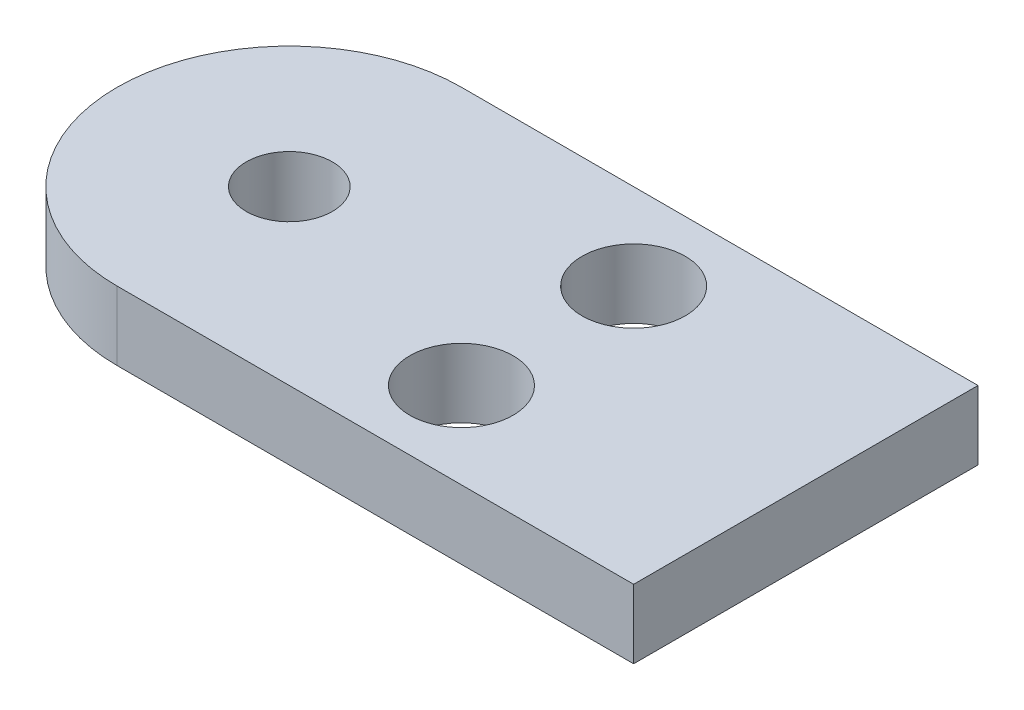
ISO-10303-21;
HEADER;
FILE_DESCRIPTION(('STEP AP214'),'2;1');
FILE_NAME('part.step','',(''),(''),'','','');
FILE_SCHEMA(('AUTOMOTIVE_DESIGN { 1 0 10303 214 1 1 1 1 }'));
ENDSEC;
DATA;
#1=APPLICATION_CONTEXT('core data for automotive mechanical design processes');
#2=APPLICATION_PROTOCOL_DEFINITION('international standard','automotive_design',2000,#1);
#3=PRODUCT_CONTEXT('',#1,'mechanical');
#4=PRODUCT('Part','Part','',(#3));
#5=PRODUCT_RELATED_PRODUCT_CATEGORY('part','',(#4));
#6=PRODUCT_DEFINITION_FORMATION('','',#4);
#7=PRODUCT_DEFINITION_CONTEXT('part definition',#1,'design');
#8=PRODUCT_DEFINITION('design','',#6,#7);
#9=PRODUCT_DEFINITION_SHAPE('','',#8);
#10=(LENGTH_UNIT() NAMED_UNIT(*) SI_UNIT(.MILLI.,.METRE.));
#11=(NAMED_UNIT(*) PLANE_ANGLE_UNIT() SI_UNIT($,.RADIAN.));
#12=(NAMED_UNIT(*) SI_UNIT($,.STERADIAN.) SOLID_ANGLE_UNIT());
#13=UNCERTAINTY_MEASURE_WITH_UNIT(LENGTH_MEASURE(1.E-05),#10,'distance_accuracy_value','');
#14=(GEOMETRIC_REPRESENTATION_CONTEXT(3) GLOBAL_UNCERTAINTY_ASSIGNED_CONTEXT((#13)) GLOBAL_UNIT_ASSIGNED_CONTEXT((#10,
#11,#12)) REPRESENTATION_CONTEXT('',''));
#15=CARTESIAN_POINT('',(0.,0.,0.));
#16=DIRECTION('',(0.,0.,1.));
#17=DIRECTION('',(1.,0.,0.));
#18=AXIS2_PLACEMENT_3D('',#15,#16,#17);
#19=CARTESIAN_POINT('',(0.,4.,0.));
#20=DIRECTION('',(0.,1.,0.));
#21=DIRECTION('',(0.,0.,1.));
#22=AXIS2_PLACEMENT_3D('',#19,#20,#21);
#23=PLANE('',#22);
#24=CARTESIAN_POINT('',(15.,4.,-5.));
#25=DIRECTION('',(0.,1.,0.));
#26=DIRECTION('',(0.,0.,1.));
#27=AXIS2_PLACEMENT_3D('',#24,#25,#26);
#28=CIRCLE('',#27,3.);
#29=CARTESIAN_POINT('',(15.,4.,-2.));
#30=VERTEX_POINT('',#29);
#31=EDGE_CURVE('E224',#30,#30,#28,.T.);
#32=ORIENTED_EDGE('',*,*,#31,.F.);
#33=EDGE_LOOP('',(#32));
#34=FACE_BOUND('',#33,.T.);
#35=CARTESIAN_POINT('',(15.,4.,5.));
#36=DIRECTION('',(0.,1.,0.));
#37=DIRECTION('',(0.,0.,1.));
#38=AXIS2_PLACEMENT_3D('',#35,#36,#37);
#39=CIRCLE('',#38,3.);
#40=CARTESIAN_POINT('',(15.,4.,8.));
#41=VERTEX_POINT('',#40);
#42=EDGE_CURVE('E218',#41,#41,#39,.T.);
#43=ORIENTED_EDGE('',*,*,#42,.F.);
#44=EDGE_LOOP('',(#43));
#45=FACE_BOUND('',#44,.T.);
#46=DIRECTION('',(1.,0.,0.));
#47=VECTOR('',#46,1.);
#48=CARTESIAN_POINT('',(30.,4.,10.));
#49=LINE('',#48,#47);
#50=CARTESIAN_POINT('',(0.,4.,10.));
#51=VERTEX_POINT('',#50);
#52=CARTESIAN_POINT('',(30.,4.,10.));
#53=VERTEX_POINT('',#52);
#54=EDGE_CURVE('E61',#51,#53,#49,.T.);
#55=ORIENTED_EDGE('',*,*,#54,.T.);
#56=DIRECTION('',(0.,0.,-1.));
#57=VECTOR('',#56,1.);
#58=CARTESIAN_POINT('',(30.,4.,-10.));
#59=LINE('',#58,#57);
#60=CARTESIAN_POINT('',(30.,4.,-10.));
#61=VERTEX_POINT('',#60);
#62=EDGE_CURVE('E90',#53,#61,#59,.T.);
#63=ORIENTED_EDGE('',*,*,#62,.T.);
#64=DIRECTION('',(-1.,0.,0.));
#65=VECTOR('',#64,1.);
#66=CARTESIAN_POINT('',(10.,4.,-10.));
#67=LINE('',#66,#65);
#68=CARTESIAN_POINT('',(0.,4.,-10.));
#69=VERTEX_POINT('',#68);
#70=EDGE_CURVE('E189',#61,#69,#67,.T.);
#71=ORIENTED_EDGE('',*,*,#70,.T.);
#72=CARTESIAN_POINT('',(0.,4.,0.));
#73=DIRECTION('',(0.,1.,0.));
#74=DIRECTION('',(0.,0.,1.));
#75=AXIS2_PLACEMENT_3D('',#72,#73,#74);
#76=CIRCLE('',#75,10.);
#77=EDGE_CURVE('E191',#69,#51,#76,.T.);
#78=ORIENTED_EDGE('',*,*,#77,.T.);
#79=EDGE_LOOP('',(#55,#63,#71,#78));
#80=FACE_BOUND('',#79,.T.);
#81=CARTESIAN_POINT('',(0.,4.,0.));
#82=DIRECTION('',(0.,1.,0.));
#83=DIRECTION('',(0.,0.,1.));
#84=AXIS2_PLACEMENT_3D('',#81,#82,#83);
#85=CIRCLE('',#84,2.5);
#86=CARTESIAN_POINT('',(0.,4.,2.5));
#87=VERTEX_POINT('',#86);
#88=EDGE_CURVE('E182',#87,#87,#85,.T.);
#89=ORIENTED_EDGE('',*,*,#88,.F.);
#90=EDGE_LOOP('',(#89));
#91=FACE_BOUND('',#90,.T.);
#92=ADVANCED_FACE('F35',(#34,#45,#80,#91),#23,.T.);
#93=CARTESIAN_POINT('',(0.,0.,0.));
#94=DIRECTION('',(0.,1.,0.));
#95=DIRECTION('',(0.,0.,1.));
#96=AXIS2_PLACEMENT_3D('',#93,#94,#95);
#97=PLANE('',#96);
#98=CARTESIAN_POINT('',(15.,0.,-5.));
#99=DIRECTION('',(0.,1.,0.));
#100=DIRECTION('',(0.,0.,1.));
#101=AXIS2_PLACEMENT_3D('',#98,#99,#100);
#102=CIRCLE('',#101,3.);
#103=CARTESIAN_POINT('',(15.,0.,-2.));
#104=VERTEX_POINT('',#103);
#105=EDGE_CURVE('E216',#104,#104,#102,.T.);
#106=ORIENTED_EDGE('',*,*,#105,.T.);
#107=EDGE_LOOP('',(#106));
#108=FACE_BOUND('',#107,.T.);
#109=CARTESIAN_POINT('',(15.,0.,5.));
#110=DIRECTION('',(0.,1.,0.));
#111=DIRECTION('',(0.,0.,1.));
#112=AXIS2_PLACEMENT_3D('',#109,#110,#111);
#113=CIRCLE('',#112,3.);
#114=CARTESIAN_POINT('',(15.,0.,8.));
#115=VERTEX_POINT('',#114);
#116=EDGE_CURVE('E221',#115,#115,#113,.T.);
#117=ORIENTED_EDGE('',*,*,#116,.T.);
#118=EDGE_LOOP('',(#117));
#119=FACE_BOUND('',#118,.T.);
#120=DIRECTION('',(0.,0.,-1.));
#121=VECTOR('',#120,1.);
#122=CARTESIAN_POINT('',(-5.5,0.,-2.5));
#123=LINE('',#122,#121);
#124=CARTESIAN_POINT('',(-5.5,0.,2.5));
#125=VERTEX_POINT('',#124);
#126=CARTESIAN_POINT('',(-5.5,0.,-2.5));
#127=VERTEX_POINT('',#126);
#128=EDGE_CURVE('E162',#125,#127,#123,.T.);
#129=ORIENTED_EDGE('',*,*,#128,.F.);
#130=DIRECTION('',(-0.707106781186548,0.,-0.707106781186547));
#131=VECTOR('',#130,1.);
#132=CARTESIAN_POINT('',(-2.5,0.,5.5));
#133=LINE('',#132,#131);
#134=CARTESIAN_POINT('',(-2.5,0.,5.5));
#135=VERTEX_POINT('',#134);
#136=EDGE_CURVE('E52',#135,#125,#133,.T.);
#137=ORIENTED_EDGE('',*,*,#136,.F.);
#138=DIRECTION('',(-1.,0.,0.));
#139=VECTOR('',#138,1.);
#140=CARTESIAN_POINT('',(6.5,0.,5.5));
#141=LINE('',#140,#139);
#142=CARTESIAN_POINT('',(6.5,0.,5.5));
#143=VERTEX_POINT('',#142);
#144=EDGE_CURVE('E145',#143,#135,#141,.T.);
#145=ORIENTED_EDGE('',*,*,#144,.F.);
#146=DIRECTION('',(0.,0.,1.));
#147=VECTOR('',#146,1.);
#148=CARTESIAN_POINT('',(6.5,0.,-5.5));
#149=LINE('',#148,#147);
#150=CARTESIAN_POINT('',(6.5,0.,-5.5));
#151=VERTEX_POINT('',#150);
#152=EDGE_CURVE('E148',#151,#143,#149,.T.);
#153=ORIENTED_EDGE('',*,*,#152,.F.);
#154=DIRECTION('',(1.,0.,0.));
#155=VECTOR('',#154,1.);
#156=CARTESIAN_POINT('',(6.5,0.,-5.5));
#157=LINE('',#156,#155);
#158=CARTESIAN_POINT('',(-2.5,0.,-5.5));
#159=VERTEX_POINT('',#158);
#160=EDGE_CURVE('E167',#159,#151,#157,.T.);
#161=ORIENTED_EDGE('',*,*,#160,.F.);
#162=DIRECTION('',(0.707106781186547,0.,-0.707106781186548));
#163=VECTOR('',#162,1.);
#164=CARTESIAN_POINT('',(-2.5,0.,-5.5));
#165=LINE('',#164,#163);
#166=EDGE_CURVE('E164',#127,#159,#165,.T.);
#167=ORIENTED_EDGE('',*,*,#166,.F.);
#168=EDGE_LOOP('',(#129,#137,#145,#153,#161,#167));
#169=FACE_BOUND('',#168,.T.);
#170=DIRECTION('',(0.,0.,-1.));
#171=VECTOR('',#170,1.);
#172=CARTESIAN_POINT('',(30.,0.,-10.));
#173=LINE('',#172,#171);
#174=CARTESIAN_POINT('',(30.,0.,10.));
#175=VERTEX_POINT('',#174);
#176=CARTESIAN_POINT('',(30.,0.,-10.));
#177=VERTEX_POINT('',#176);
#178=EDGE_CURVE('E185',#175,#177,#173,.T.);
#179=ORIENTED_EDGE('',*,*,#178,.F.);
#180=DIRECTION('',(1.,0.,0.));
#181=VECTOR('',#180,1.);
#182=CARTESIAN_POINT('',(0.,0.,10.));
#183=LINE('',#182,#181);
#184=CARTESIAN_POINT('',(0.,0.,10.));
#185=VERTEX_POINT('',#184);
#186=EDGE_CURVE('E187',#185,#175,#183,.T.);
#187=ORIENTED_EDGE('',*,*,#186,.F.);
#188=CARTESIAN_POINT('',(0.,0.,0.));
#189=DIRECTION('',(0.,1.,0.));
#190=DIRECTION('',(0.,0.,1.));
#191=AXIS2_PLACEMENT_3D('',#188,#189,#190);
#192=CIRCLE('',#191,10.);
#193=CARTESIAN_POINT('',(0.,0.,-10.));
#194=VERTEX_POINT('',#193);
#195=EDGE_CURVE('E84',#194,#185,#192,.T.);
#196=ORIENTED_EDGE('',*,*,#195,.F.);
#197=DIRECTION('',(-1.,0.,0.));
#198=VECTOR('',#197,1.);
#199=CARTESIAN_POINT('',(0.,0.,-10.));
#200=LINE('',#199,#198);
#201=EDGE_CURVE('E196',#177,#194,#200,.T.);
#202=ORIENTED_EDGE('',*,*,#201,.F.);
#203=EDGE_LOOP('',(#179,#187,#196,#202));
#204=FACE_BOUND('',#203,.T.);
#205=ADVANCED_FACE('F230',(#108,#119,#169,#204),#97,.F.);
#206=CARTESIAN_POINT('',(30.,4.,-10.));
#207=DIRECTION('',(-1.,0.,0.));
#208=DIRECTION('',(0.,0.,1.));
#209=AXIS2_PLACEMENT_3D('',#206,#207,#208);
#210=PLANE('',#209);
#211=ORIENTED_EDGE('',*,*,#178,.T.);
#212=DIRECTION('',(0.,-1.,0.));
#213=VECTOR('',#212,1.);
#214=CARTESIAN_POINT('',(30.,4.,-10.));
#215=LINE('',#214,#213);
#216=EDGE_CURVE('E44',#61,#177,#215,.T.);
#217=ORIENTED_EDGE('',*,*,#216,.F.);
#218=ORIENTED_EDGE('',*,*,#62,.F.);
#219=DIRECTION('',(0.,-1.,0.));
#220=VECTOR('',#219,1.);
#221=CARTESIAN_POINT('',(30.,4.,10.));
#222=LINE('',#221,#220);
#223=EDGE_CURVE('E11',#53,#175,#222,.T.);
#224=ORIENTED_EDGE('',*,*,#223,.T.);
#225=EDGE_LOOP('',(#211,#217,#218,#224));
#226=FACE_BOUND('',#225,.T.);
#227=ADVANCED_FACE('F37',(#226),#210,.F.);
#228=CARTESIAN_POINT('',(0.,4.,-10.));
#229=DIRECTION('',(0.,0.,1.));
#230=DIRECTION('',(1.,0.,0.));
#231=AXIS2_PLACEMENT_3D('',#228,#229,#230);
#232=PLANE('',#231);
#233=ORIENTED_EDGE('',*,*,#201,.T.);
#234=DIRECTION('',(0.,-1.,0.));
#235=VECTOR('',#234,1.);
#236=CARTESIAN_POINT('',(0.,4.,-10.));
#237=LINE('',#236,#235);
#238=EDGE_CURVE('E201',#69,#194,#237,.T.);
#239=ORIENTED_EDGE('',*,*,#238,.F.);
#240=ORIENTED_EDGE('',*,*,#70,.F.);
#241=ORIENTED_EDGE('',*,*,#216,.T.);
#242=EDGE_LOOP('',(#233,#239,#240,#241));
#243=FACE_BOUND('',#242,.T.);
#244=ADVANCED_FACE('F267',(#243),#232,.F.);
#245=CARTESIAN_POINT('',(0.,4.,0.));
#246=DIRECTION('',(0.,-1.,0.));
#247=DIRECTION('',(0.,0.,-1.));
#248=AXIS2_PLACEMENT_3D('',#245,#246,#247);
#249=CYLINDRICAL_SURFACE('',#248,10.);
#250=ORIENTED_EDGE('',*,*,#195,.T.);
#251=DIRECTION('',(0.,-1.,0.));
#252=VECTOR('',#251,1.);
#253=CARTESIAN_POINT('',(0.,4.,10.));
#254=LINE('',#253,#252);
#255=EDGE_CURVE('E193',#51,#185,#254,.T.);
#256=ORIENTED_EDGE('',*,*,#255,.F.);
#257=ORIENTED_EDGE('',*,*,#77,.F.);
#258=ORIENTED_EDGE('',*,*,#238,.T.);
#259=EDGE_LOOP('',(#250,#256,#257,#258));
#260=FACE_BOUND('',#259,.T.);
#261=ADVANCED_FACE('F259',(#260),#249,.T.);
#262=CARTESIAN_POINT('',(0.,4.,10.));
#263=DIRECTION('',(0.,0.,-1.));
#264=DIRECTION('',(-1.,0.,0.));
#265=AXIS2_PLACEMENT_3D('',#262,#263,#264);
#266=PLANE('',#265);
#267=ORIENTED_EDGE('',*,*,#186,.T.);
#268=ORIENTED_EDGE('',*,*,#223,.F.);
#269=ORIENTED_EDGE('',*,*,#54,.F.);
#270=ORIENTED_EDGE('',*,*,#255,.T.);
#271=EDGE_LOOP('',(#267,#268,#269,#270));
#272=FACE_BOUND('',#271,.T.);
#273=ADVANCED_FACE('F250',(#272),#266,.F.);
#274=CARTESIAN_POINT('',(0.,4.,0.));
#275=DIRECTION('',(0.,-1.,0.));
#276=DIRECTION('',(0.,0.,-1.));
#277=AXIS2_PLACEMENT_3D('',#274,#275,#276);
#278=CYLINDRICAL_SURFACE('',#277,2.5);
#279=CARTESIAN_POINT('',(0.,0.2,0.));
#280=DIRECTION('',(0.,1.,0.));
#281=DIRECTION('',(0.,0.,1.));
#282=AXIS2_PLACEMENT_3D('',#279,#280,#281);
#283=CIRCLE('',#282,2.5);
#284=CARTESIAN_POINT('',(0.,0.2,2.5));
#285=VERTEX_POINT('',#284);
#286=EDGE_CURVE('E174',#285,#285,#283,.T.);
#287=ORIENTED_EDGE('',*,*,#286,.F.);
#288=EDGE_LOOP('',(#287));
#289=FACE_BOUND('',#288,.T.);
#290=ORIENTED_EDGE('',*,*,#88,.T.);
#291=EDGE_LOOP('',(#290));
#292=FACE_BOUND('',#291,.T.);
#293=ADVANCED_FACE('F248',(#289,#292),#278,.F.);
#294=CARTESIAN_POINT('',(-2.5,0.2,5.5));
#295=DIRECTION('',(-0.707106781186547,0.,0.707106781186548));
#296=DIRECTION('',(0.707106781186548,0.,0.707106781186547));
#297=AXIS2_PLACEMENT_3D('',#294,#295,#296);
#298=PLANE('',#297);
#299=ORIENTED_EDGE('',*,*,#136,.T.);
#300=DIRECTION('',(0.,-1.,0.));
#301=VECTOR('',#300,1.);
#302=CARTESIAN_POINT('',(-5.5,0.2,2.5));
#303=LINE('',#302,#301);
#304=CARTESIAN_POINT('',(-5.5,0.2,2.5));
#305=VERTEX_POINT('',#304);
#306=EDGE_CURVE('E122',#305,#125,#303,.T.);
#307=ORIENTED_EDGE('',*,*,#306,.F.);
#308=DIRECTION('',(-0.707106781186548,0.,-0.707106781186547));
#309=VECTOR('',#308,1.);
#310=CARTESIAN_POINT('',(-2.5,0.2,5.5));
#311=LINE('',#310,#309);
#312=CARTESIAN_POINT('',(-2.5,0.2,5.5));
#313=VERTEX_POINT('',#312);
#314=EDGE_CURVE('E126',#313,#305,#311,.T.);
#315=ORIENTED_EDGE('',*,*,#314,.F.);
#316=DIRECTION('',(0.,-1.,0.));
#317=VECTOR('',#316,1.);
#318=CARTESIAN_POINT('',(-2.5,0.2,5.5));
#319=LINE('',#318,#317);
#320=EDGE_CURVE('E172',#313,#135,#319,.T.);
#321=ORIENTED_EDGE('',*,*,#320,.T.);
#322=EDGE_LOOP('',(#299,#307,#315,#321));
#323=FACE_BOUND('',#322,.T.);
#324=ADVANCED_FACE('F124',(#323),#298,.F.);
#325=CARTESIAN_POINT('',(6.5,0.2,5.5));
#326=DIRECTION('',(0.,0.,1.));
#327=DIRECTION('',(1.,0.,0.));
#328=AXIS2_PLACEMENT_3D('',#325,#326,#327);
#329=PLANE('',#328);
#330=ORIENTED_EDGE('',*,*,#144,.T.);
#331=ORIENTED_EDGE('',*,*,#320,.F.);
#332=DIRECTION('',(-1.,0.,0.));
#333=VECTOR('',#332,1.);
#334=CARTESIAN_POINT('',(6.5,0.2,5.5));
#335=LINE('',#334,#333);
#336=CARTESIAN_POINT('',(6.5,0.2,5.5));
#337=VERTEX_POINT('',#336);
#338=EDGE_CURVE('E132',#337,#313,#335,.T.);
#339=ORIENTED_EDGE('',*,*,#338,.F.);
#340=DIRECTION('',(0.,-1.,0.));
#341=VECTOR('',#340,1.);
#342=CARTESIAN_POINT('',(6.5,0.2,5.5));
#343=LINE('',#342,#341);
#344=EDGE_CURVE('E175',#337,#143,#343,.T.);
#345=ORIENTED_EDGE('',*,*,#344,.T.);
#346=EDGE_LOOP('',(#330,#331,#339,#345));
#347=FACE_BOUND('',#346,.T.);
#348=ADVANCED_FACE('F257',(#347),#329,.F.);
#349=CARTESIAN_POINT('',(6.5,0.2,-5.5));
#350=DIRECTION('',(1.,0.,0.));
#351=DIRECTION('',(0.,0.,-1.));
#352=AXIS2_PLACEMENT_3D('',#349,#350,#351);
#353=PLANE('',#352);
#354=ORIENTED_EDGE('',*,*,#152,.T.);
#355=ORIENTED_EDGE('',*,*,#344,.F.);
#356=DIRECTION('',(0.,0.,1.));
#357=VECTOR('',#356,1.);
#358=CARTESIAN_POINT('',(6.5,0.2,-5.5));
#359=LINE('',#358,#357);
#360=CARTESIAN_POINT('',(6.5,0.2,-5.5));
#361=VERTEX_POINT('',#360);
#362=EDGE_CURVE('E158',#361,#337,#359,.T.);
#363=ORIENTED_EDGE('',*,*,#362,.F.);
#364=DIRECTION('',(0.,-1.,0.));
#365=VECTOR('',#364,1.);
#366=CARTESIAN_POINT('',(6.5,0.2,-5.5));
#367=LINE('',#366,#365);
#368=EDGE_CURVE('E177',#361,#151,#367,.T.);
#369=ORIENTED_EDGE('',*,*,#368,.T.);
#370=EDGE_LOOP('',(#354,#355,#363,#369));
#371=FACE_BOUND('',#370,.T.);
#372=ADVANCED_FACE('F367',(#371),#353,.F.);
#373=CARTESIAN_POINT('',(6.5,0.2,-5.5));
#374=DIRECTION('',(0.,0.,-1.));
#375=DIRECTION('',(-1.,0.,0.));
#376=AXIS2_PLACEMENT_3D('',#373,#374,#375);
#377=PLANE('',#376);
#378=ORIENTED_EDGE('',*,*,#160,.T.);
#379=ORIENTED_EDGE('',*,*,#368,.F.);
#380=DIRECTION('',(1.,0.,0.));
#381=VECTOR('',#380,1.);
#382=CARTESIAN_POINT('',(6.5,0.2,-5.5));
#383=LINE('',#382,#381);
#384=CARTESIAN_POINT('',(-2.5,0.2,-5.5));
#385=VERTEX_POINT('',#384);
#386=EDGE_CURVE('E155',#385,#361,#383,.T.);
#387=ORIENTED_EDGE('',*,*,#386,.F.);
#388=DIRECTION('',(0.,-1.,0.));
#389=VECTOR('',#388,1.);
#390=CARTESIAN_POINT('',(-2.5,0.2,-5.5));
#391=LINE('',#390,#389);
#392=EDGE_CURVE('E179',#385,#159,#391,.T.);
#393=ORIENTED_EDGE('',*,*,#392,.T.);
#394=EDGE_LOOP('',(#378,#379,#387,#393));
#395=FACE_BOUND('',#394,.T.);
#396=ADVANCED_FACE('F357',(#395),#377,.F.);
#397=CARTESIAN_POINT('',(-2.5,0.2,-5.5));
#398=DIRECTION('',(-0.707106781186548,0.,-0.707106781186548));
#399=DIRECTION('',(-0.707106781186547,0.,0.707106781186548));
#400=AXIS2_PLACEMENT_3D('',#397,#398,#399);
#401=PLANE('',#400);
#402=ORIENTED_EDGE('',*,*,#166,.T.);
#403=ORIENTED_EDGE('',*,*,#392,.F.);
#404=DIRECTION('',(0.707106781186547,0.,-0.707106781186548));
#405=VECTOR('',#404,1.);
#406=CARTESIAN_POINT('',(-2.5,0.2,-5.5));
#407=LINE('',#406,#405);
#408=CARTESIAN_POINT('',(-5.5,0.2,-2.5));
#409=VERTEX_POINT('',#408);
#410=EDGE_CURVE('E140',#409,#385,#407,.T.);
#411=ORIENTED_EDGE('',*,*,#410,.F.);
#412=DIRECTION('',(0.,-1.,0.));
#413=VECTOR('',#412,1.);
#414=CARTESIAN_POINT('',(-5.5,0.2,-2.5));
#415=LINE('',#414,#413);
#416=EDGE_CURVE('E131',#409,#127,#415,.T.);
#417=ORIENTED_EDGE('',*,*,#416,.T.);
#418=EDGE_LOOP('',(#402,#403,#411,#417));
#419=FACE_BOUND('',#418,.T.);
#420=ADVANCED_FACE('F349',(#419),#401,.F.);
#421=CARTESIAN_POINT('',(-5.5,0.2,-2.5));
#422=DIRECTION('',(-1.,0.,0.));
#423=DIRECTION('',(0.,0.,1.));
#424=AXIS2_PLACEMENT_3D('',#421,#422,#423);
#425=PLANE('',#424);
#426=ORIENTED_EDGE('',*,*,#128,.T.);
#427=ORIENTED_EDGE('',*,*,#416,.F.);
#428=DIRECTION('',(0.,0.,-1.));
#429=VECTOR('',#428,1.);
#430=CARTESIAN_POINT('',(-5.5,0.2,-2.5));
#431=LINE('',#430,#429);
#432=EDGE_CURVE('E135',#305,#409,#431,.T.);
#433=ORIENTED_EDGE('',*,*,#432,.F.);
#434=ORIENTED_EDGE('',*,*,#306,.T.);
#435=EDGE_LOOP('',(#426,#427,#433,#434));
#436=FACE_BOUND('',#435,.T.);
#437=ADVANCED_FACE('F136',(#436),#425,.F.);
#438=CARTESIAN_POINT('',(0.,0.2,0.));
#439=DIRECTION('',(0.,1.,0.));
#440=DIRECTION('',(0.,0.,1.));
#441=AXIS2_PLACEMENT_3D('',#438,#439,#440);
#442=PLANE('',#441);
#443=CARTESIAN_POINT('',(5.5,0.2,4.25));
#444=DIRECTION('',(0.,1.,0.));
#445=DIRECTION('',(0.,0.,1.));
#446=AXIS2_PLACEMENT_3D('',#443,#444,#445);
#447=CIRCLE('',#446,0.500000000000001);
#448=CARTESIAN_POINT('',(5.5,0.2,4.75));
#449=VERTEX_POINT('',#448);
#450=EDGE_CURVE('E39',#449,#449,#447,.T.);
#451=ORIENTED_EDGE('',*,*,#450,.T.);
#452=EDGE_LOOP('',(#451));
#453=FACE_BOUND('',#452,.T.);
#454=CARTESIAN_POINT('',(5.5,0.2,-4.25));
#455=DIRECTION('',(0.,1.,0.));
#456=DIRECTION('',(0.,0.,1.));
#457=AXIS2_PLACEMENT_3D('',#454,#455,#456);
#458=CIRCLE('',#457,0.500000000000001);
#459=CARTESIAN_POINT('',(5.5,0.2,-3.75));
#460=VERTEX_POINT('',#459);
#461=EDGE_CURVE('E206',#460,#460,#458,.T.);
#462=ORIENTED_EDGE('',*,*,#461,.T.);
#463=EDGE_LOOP('',(#462));
#464=FACE_BOUND('',#463,.T.);
#465=ORIENTED_EDGE('',*,*,#286,.T.);
#466=EDGE_LOOP('',(#465));
#467=FACE_BOUND('',#466,.T.);
#468=ORIENTED_EDGE('',*,*,#314,.T.);
#469=ORIENTED_EDGE('',*,*,#432,.T.);
#470=ORIENTED_EDGE('',*,*,#410,.T.);
#471=ORIENTED_EDGE('',*,*,#386,.T.);
#472=ORIENTED_EDGE('',*,*,#362,.T.);
#473=ORIENTED_EDGE('',*,*,#338,.T.);
#474=EDGE_LOOP('',(#468,#469,#470,#471,#472,#473));
#475=FACE_BOUND('',#474,.T.);
#476=ADVANCED_FACE('F142',(#453,#464,#467,#475),#442,.F.);
#477=CARTESIAN_POINT('',(5.5,1.5,-4.25));
#478=DIRECTION('',(0.,-1.,0.));
#479=DIRECTION('',(0.,0.,-1.));
#480=AXIS2_PLACEMENT_3D('',#477,#478,#479);
#481=CYLINDRICAL_SURFACE('',#480,0.500000000000001);
#482=CARTESIAN_POINT('',(5.5,1.5,-4.25));
#483=DIRECTION('',(0.,-1.,0.));
#484=DIRECTION('',(0.,0.,-1.));
#485=AXIS2_PLACEMENT_3D('',#482,#483,#484);
#486=CIRCLE('',#485,0.500000000000001);
#487=CARTESIAN_POINT('',(5.5,1.5,-4.75));
#488=VERTEX_POINT('',#487);
#489=EDGE_CURVE('E151',#488,#488,#486,.T.);
#490=ORIENTED_EDGE('',*,*,#489,.F.);
#491=EDGE_LOOP('',(#490));
#492=FACE_BOUND('',#491,.T.);
#493=ORIENTED_EDGE('',*,*,#461,.F.);
#494=EDGE_LOOP('',(#493));
#495=FACE_BOUND('',#494,.T.);
#496=ADVANCED_FACE('F321',(#492,#495),#481,.F.);
#497=CARTESIAN_POINT('',(5.5,1.5,-4.25));
#498=DIRECTION('',(0.,-1.,0.));
#499=DIRECTION('',(0.,0.,-1.));
#500=AXIS2_PLACEMENT_3D('',#497,#498,#499);
#501=PLANE('',#500);
#502=ORIENTED_EDGE('',*,*,#489,.T.);
#503=EDGE_LOOP('',(#502));
#504=FACE_BOUND('',#503,.T.);
#505=ADVANCED_FACE('F311',(#504),#501,.T.);
#506=CARTESIAN_POINT('',(5.5,1.5,4.25));
#507=DIRECTION('',(0.,-1.,0.));
#508=DIRECTION('',(0.,0.,-1.));
#509=AXIS2_PLACEMENT_3D('',#506,#507,#508);
#510=CYLINDRICAL_SURFACE('',#509,0.500000000000001);
#511=CARTESIAN_POINT('',(5.5,1.5,4.25));
#512=DIRECTION('',(0.,-1.,0.));
#513=DIRECTION('',(0.,0.,-1.));
#514=AXIS2_PLACEMENT_3D('',#511,#512,#513);
#515=CIRCLE('',#514,0.500000000000001);
#516=CARTESIAN_POINT('',(5.5,1.5,3.75));
#517=VERTEX_POINT('',#516);
#518=EDGE_CURVE('E208',#517,#517,#515,.T.);
#519=ORIENTED_EDGE('',*,*,#518,.F.);
#520=EDGE_LOOP('',(#519));
#521=FACE_BOUND('',#520,.T.);
#522=ORIENTED_EDGE('',*,*,#450,.F.);
#523=EDGE_LOOP('',(#522));
#524=FACE_BOUND('',#523,.T.);
#525=ADVANCED_FACE('F300',(#521,#524),#510,.F.);
#526=CARTESIAN_POINT('',(5.5,1.5,4.25));
#527=DIRECTION('',(0.,-1.,0.));
#528=DIRECTION('',(0.,0.,-1.));
#529=AXIS2_PLACEMENT_3D('',#526,#527,#528);
#530=PLANE('',#529);
#531=ORIENTED_EDGE('',*,*,#518,.T.);
#532=EDGE_LOOP('',(#531));
#533=FACE_BOUND('',#532,.T.);
#534=ADVANCED_FACE('F295',(#533),#530,.T.);
#535=CARTESIAN_POINT('',(15.,0.,5.));
#536=DIRECTION('',(0.,1.,0.));
#537=DIRECTION('',(0.,0.,1.));
#538=AXIS2_PLACEMENT_3D('',#535,#536,#537);
#539=CYLINDRICAL_SURFACE('',#538,3.);
#540=ORIENTED_EDGE('',*,*,#116,.F.);
#541=EDGE_LOOP('',(#540));
#542=FACE_BOUND('',#541,.T.);
#543=ORIENTED_EDGE('',*,*,#42,.T.);
#544=EDGE_LOOP('',(#543));
#545=FACE_BOUND('',#544,.T.);
#546=ADVANCED_FACE('F236',(#542,#545),#539,.F.);
#547=CARTESIAN_POINT('',(15.,0.,-5.));
#548=DIRECTION('',(0.,1.,0.));
#549=DIRECTION('',(0.,0.,1.));
#550=AXIS2_PLACEMENT_3D('',#547,#548,#549);
#551=CYLINDRICAL_SURFACE('',#550,3.);
#552=ORIENTED_EDGE('',*,*,#105,.F.);
#553=EDGE_LOOP('',(#552));
#554=FACE_BOUND('',#553,.T.);
#555=ORIENTED_EDGE('',*,*,#31,.T.);
#556=EDGE_LOOP('',(#555));
#557=FACE_BOUND('',#556,.T.);
#558=ADVANCED_FACE('F233',(#554,#557),#551,.F.);
#559=CLOSED_SHELL('',(#92,#205,#227,#244,#261,#273,#293,#324,#348,#372,#396,#420,#437,#476,#496,
#505,#525,#534,#546,#558));
#560=MANIFOLD_SOLID_BREP('B2',#559);
#561=ADVANCED_BREP_SHAPE_REPRESENTATION('',(#18,#560),#14);
#562=SHAPE_DEFINITION_REPRESENTATION(#9,#561);
ENDSEC;
END-ISO-10303-21;
